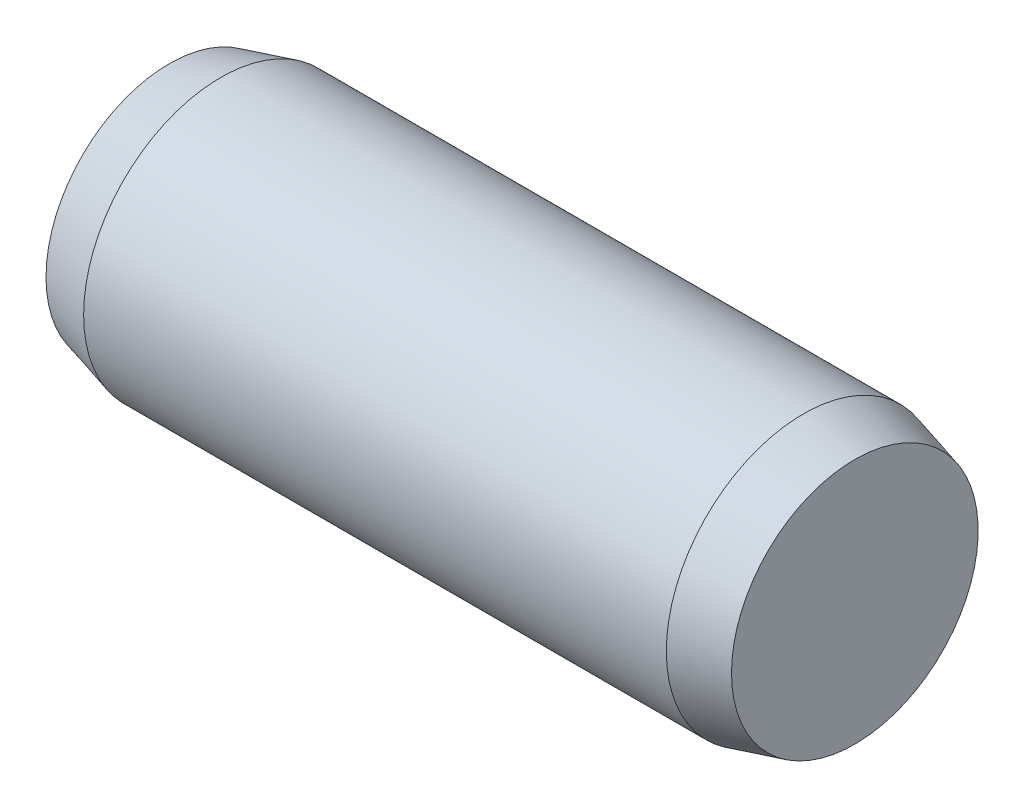
ISO-10303-21;
HEADER;
FILE_DESCRIPTION(('STEP AP214'),'2;1');
FILE_NAME('part.step','',(''),(''),'','','');
FILE_SCHEMA(('AUTOMOTIVE_DESIGN { 1 0 10303 214 1 1 1 1 }'));
ENDSEC;
DATA;
#1=APPLICATION_CONTEXT('core data for automotive mechanical design processes');
#2=APPLICATION_PROTOCOL_DEFINITION('international standard','automotive_design',2000,#1);
#3=PRODUCT_CONTEXT('',#1,'mechanical');
#4=PRODUCT('Part','Part','',(#3));
#5=PRODUCT_RELATED_PRODUCT_CATEGORY('part','',(#4));
#6=PRODUCT_DEFINITION_FORMATION('','',#4);
#7=PRODUCT_DEFINITION_CONTEXT('part definition',#1,'design');
#8=PRODUCT_DEFINITION('design','',#6,#7);
#9=PRODUCT_DEFINITION_SHAPE('','',#8);
#10=(LENGTH_UNIT() NAMED_UNIT(*) SI_UNIT(.MILLI.,.METRE.));
#11=(NAMED_UNIT(*) PLANE_ANGLE_UNIT() SI_UNIT($,.RADIAN.));
#12=(NAMED_UNIT(*) SI_UNIT($,.STERADIAN.) SOLID_ANGLE_UNIT());
#13=UNCERTAINTY_MEASURE_WITH_UNIT(LENGTH_MEASURE(1.E-05),#10,'distance_accuracy_value','');
#14=(GEOMETRIC_REPRESENTATION_CONTEXT(3) GLOBAL_UNCERTAINTY_ASSIGNED_CONTEXT((#13)) GLOBAL_UNIT_ASSIGNED_CONTEXT((#10,
#11,#12)) REPRESENTATION_CONTEXT('',''));
#15=CARTESIAN_POINT('',(0.,0.,0.));
#16=DIRECTION('',(0.,0.,1.));
#17=DIRECTION('',(1.,0.,0.));
#18=AXIS2_PLACEMENT_3D('',#15,#16,#17);
#19=CARTESIAN_POINT('',(0.,7.19615242270665,0.));
#20=DIRECTION('',(1.,0.,0.));
#21=DIRECTION('',(0.,0.,-1.));
#22=AXIS2_PLACEMENT_3D('',#19,#20,#21);
#23=PLANE('',#22);
#24=CARTESIAN_POINT('',(0.,0.,0.));
#25=DIRECTION('',(-1.,0.,0.));
#26=DIRECTION('',(0.,0.,1.));
#27=AXIS2_PLACEMENT_3D('',#24,#25,#26);
#28=CIRCLE('',#27,7.19615242270665);
#29=CARTESIAN_POINT('',(0.,0.,7.19615242270665));
#30=VERTEX_POINT('',#29);
#31=EDGE_CURVE('E45',#30,#30,#28,.T.);
#32=ORIENTED_EDGE('',*,*,#31,.T.);
#33=EDGE_LOOP('',(#32));
#34=FACE_BOUND('',#33,.T.);
#35=ADVANCED_FACE('F31',(#34),#23,.F.);
#36=CARTESIAN_POINT('',(40.,0.,0.));
#37=DIRECTION('',(-1.,0.,0.));
#38=DIRECTION('',(0.,0.,1.));
#39=AXIS2_PLACEMENT_3D('',#36,#37,#38);
#40=PLANE('',#39);
#41=CARTESIAN_POINT('',(40.,0.,0.));
#42=DIRECTION('',(-1.,0.,0.));
#43=DIRECTION('',(0.,0.,1.));
#44=AXIS2_PLACEMENT_3D('',#41,#42,#43);
#45=CIRCLE('',#44,7.19615242270662);
#46=CARTESIAN_POINT('',(40.,0.,7.19615242270662));
#47=VERTEX_POINT('',#46);
#48=EDGE_CURVE('E10',#47,#47,#45,.T.);
#49=ORIENTED_EDGE('',*,*,#48,.F.);
#50=EDGE_LOOP('',(#49));
#51=FACE_BOUND('',#50,.T.);
#52=ADVANCED_FACE('F65',(#51),#40,.F.);
#53=CARTESIAN_POINT('',(40.,0.,0.));
#54=DIRECTION('',(-1.,0.,0.));
#55=DIRECTION('',(0.,0.,1.));
#56=AXIS2_PLACEMENT_3D('',#53,#54,#55);
#57=CONICAL_SURFACE('',#56,7.19615242270662,0.26179938779915);
#58=CARTESIAN_POINT('',(37.,0.,0.));
#59=DIRECTION('',(-1.,0.,0.));
#60=DIRECTION('',(0.,0.,1.));
#61=AXIS2_PLACEMENT_3D('',#58,#59,#60);
#62=CIRCLE('',#61,7.99999999999999);
#63=CARTESIAN_POINT('',(37.,0.,7.99999999999999));
#64=VERTEX_POINT('',#63);
#65=EDGE_CURVE('E37',#64,#64,#62,.T.);
#66=ORIENTED_EDGE('',*,*,#65,.F.);
#67=EDGE_LOOP('',(#66));
#68=FACE_BOUND('',#67,.T.);
#69=ORIENTED_EDGE('',*,*,#48,.T.);
#70=EDGE_LOOP('',(#69));
#71=FACE_BOUND('',#70,.T.);
#72=ADVANCED_FACE('F60',(#68,#71),#57,.T.);
#73=CARTESIAN_POINT('',(-6.35,0.,0.));
#74=DIRECTION('',(-1.,0.,0.));
#75=DIRECTION('',(0.,0.,1.));
#76=AXIS2_PLACEMENT_3D('',#73,#74,#75);
#77=CYLINDRICAL_SURFACE('',#76,8.);
#78=CARTESIAN_POINT('',(3.,0.,0.));
#79=DIRECTION('',(-1.,0.,0.));
#80=DIRECTION('',(0.,0.,1.));
#81=AXIS2_PLACEMENT_3D('',#78,#79,#80);
#82=CIRCLE('',#81,8.);
#83=CARTESIAN_POINT('',(3.,0.,8.));
#84=VERTEX_POINT('',#83);
#85=EDGE_CURVE('E41',#84,#84,#82,.T.);
#86=ORIENTED_EDGE('',*,*,#85,.F.);
#87=EDGE_LOOP('',(#86));
#88=FACE_BOUND('',#87,.T.);
#89=ORIENTED_EDGE('',*,*,#65,.T.);
#90=EDGE_LOOP('',(#89));
#91=FACE_BOUND('',#90,.T.);
#92=ADVANCED_FACE('F55',(#88,#91),#77,.T.);
#93=CARTESIAN_POINT('',(3.,0.,0.));
#94=DIRECTION('',(1.,0.,0.));
#95=DIRECTION('',(0.,0.,-1.));
#96=AXIS2_PLACEMENT_3D('',#93,#94,#95);
#97=CONICAL_SURFACE('',#96,8.,0.261799387799143);
#98=ORIENTED_EDGE('',*,*,#31,.F.);
#99=EDGE_LOOP('',(#98));
#100=FACE_BOUND('',#99,.T.);
#101=ORIENTED_EDGE('',*,*,#85,.T.);
#102=EDGE_LOOP('',(#101));
#103=FACE_BOUND('',#102,.T.);
#104=ADVANCED_FACE('F52',(#100,#103),#97,.T.);
#105=CLOSED_SHELL('',(#35,#52,#72,#92,#104));
#106=MANIFOLD_SOLID_BREP('B2',#105);
#107=ADVANCED_BREP_SHAPE_REPRESENTATION('',(#18,#106),#14);
#108=SHAPE_DEFINITION_REPRESENTATION(#9,#107);
ENDSEC;
END-ISO-10303-21;
